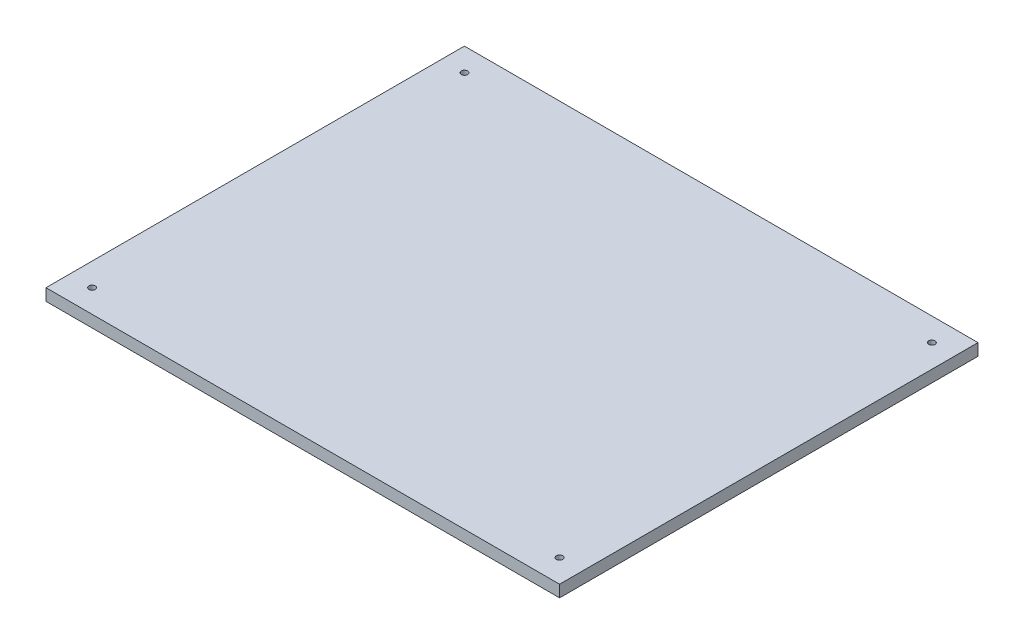
ISO-10303-21;
HEADER;
FILE_DESCRIPTION(('STEP AP214'),'2;1');
FILE_NAME('part.step','',(''),(''),'','','');
FILE_SCHEMA(('AUTOMOTIVE_DESIGN { 1 0 10303 214 1 1 1 1 }'));
ENDSEC;
DATA;
#1=APPLICATION_CONTEXT('core data for automotive mechanical design processes');
#2=APPLICATION_PROTOCOL_DEFINITION('international standard','automotive_design',2000,#1);
#3=PRODUCT_CONTEXT('',#1,'mechanical');
#4=PRODUCT('Part','Part','',(#3));
#5=PRODUCT_RELATED_PRODUCT_CATEGORY('part','',(#4));
#6=PRODUCT_DEFINITION_FORMATION('','',#4);
#7=PRODUCT_DEFINITION_CONTEXT('part definition',#1,'design');
#8=PRODUCT_DEFINITION('design','',#6,#7);
#9=PRODUCT_DEFINITION_SHAPE('','',#8);
#10=(LENGTH_UNIT() NAMED_UNIT(*) SI_UNIT(.MILLI.,.METRE.));
#11=(NAMED_UNIT(*) PLANE_ANGLE_UNIT() SI_UNIT($,.RADIAN.));
#12=(NAMED_UNIT(*) SI_UNIT($,.STERADIAN.) SOLID_ANGLE_UNIT());
#13=UNCERTAINTY_MEASURE_WITH_UNIT(LENGTH_MEASURE(1.E-05),#10,'distance_accuracy_value','');
#14=(GEOMETRIC_REPRESENTATION_CONTEXT(3) GLOBAL_UNCERTAINTY_ASSIGNED_CONTEXT((#13)) GLOBAL_UNIT_ASSIGNED_CONTEXT((#10,
#11,#12)) REPRESENTATION_CONTEXT('',''));
#15=CARTESIAN_POINT('',(0.,0.,0.));
#16=DIRECTION('',(0.,0.,1.));
#17=DIRECTION('',(1.,0.,0.));
#18=AXIS2_PLACEMENT_3D('',#15,#16,#17);
#19=CARTESIAN_POINT('',(137.3886,6.35,-111.9378));
#20=DIRECTION('',(-1.,0.,0.));
#21=DIRECTION('',(0.,0.,1.));
#22=AXIS2_PLACEMENT_3D('',#19,#20,#21);
#23=PLANE('',#22);
#24=DIRECTION('',(0.,0.,-1.));
#25=VECTOR('',#24,1.);
#26=CARTESIAN_POINT('',(137.3886,0.,-111.9378));
#27=LINE('',#26,#25);
#28=CARTESIAN_POINT('',(137.3886,0.,111.9378));
#29=VERTEX_POINT('',#28);
#30=CARTESIAN_POINT('',(137.3886,0.,-111.9378));
#31=VERTEX_POINT('',#30);
#32=EDGE_CURVE('E107',#29,#31,#27,.T.);
#33=ORIENTED_EDGE('',*,*,#32,.T.);
#34=DIRECTION('',(0.,-1.,0.));
#35=VECTOR('',#34,1.);
#36=CARTESIAN_POINT('',(137.3886,6.35,-111.9378));
#37=LINE('',#36,#35);
#38=CARTESIAN_POINT('',(137.3886,6.35,-111.9378));
#39=VERTEX_POINT('',#38);
#40=EDGE_CURVE('E11',#39,#31,#37,.T.);
#41=ORIENTED_EDGE('',*,*,#40,.F.);
#42=DIRECTION('',(0.,0.,-1.));
#43=VECTOR('',#42,1.);
#44=CARTESIAN_POINT('',(137.3886,6.35,-111.9378));
#45=LINE('',#44,#43);
#46=CARTESIAN_POINT('',(137.3886,6.35,111.9378));
#47=VERTEX_POINT('',#46);
#48=EDGE_CURVE('E91',#47,#39,#45,.T.);
#49=ORIENTED_EDGE('',*,*,#48,.F.);
#50=DIRECTION('',(0.,-1.,0.));
#51=VECTOR('',#50,1.);
#52=CARTESIAN_POINT('',(137.3886,6.35,111.9378));
#53=LINE('',#52,#51);
#54=EDGE_CURVE('E103',#47,#29,#53,.T.);
#55=ORIENTED_EDGE('',*,*,#54,.T.);
#56=EDGE_LOOP('',(#33,#41,#49,#55));
#57=FACE_BOUND('',#56,.T.);
#58=ADVANCED_FACE('F39',(#57),#23,.F.);
#59=CARTESIAN_POINT('',(-137.3886,6.35,-111.9378));
#60=DIRECTION('',(0.,0.,1.));
#61=DIRECTION('',(1.,0.,0.));
#62=AXIS2_PLACEMENT_3D('',#59,#60,#61);
#63=PLANE('',#62);
#64=DIRECTION('',(-1.,0.,0.));
#65=VECTOR('',#64,1.);
#66=CARTESIAN_POINT('',(-137.3886,0.,-111.9378));
#67=LINE('',#66,#65);
#68=CARTESIAN_POINT('',(-137.3886,0.,-111.9378));
#69=VERTEX_POINT('',#68);
#70=EDGE_CURVE('E96',#31,#69,#67,.T.);
#71=ORIENTED_EDGE('',*,*,#70,.T.);
#72=DIRECTION('',(0.,-1.,0.));
#73=VECTOR('',#72,1.);
#74=CARTESIAN_POINT('',(-137.3886,6.35,-111.9378));
#75=LINE('',#74,#73);
#76=CARTESIAN_POINT('',(-137.3886,6.35,-111.9378));
#77=VERTEX_POINT('',#76);
#78=EDGE_CURVE('E48',#77,#69,#75,.T.);
#79=ORIENTED_EDGE('',*,*,#78,.F.);
#80=DIRECTION('',(-1.,0.,0.));
#81=VECTOR('',#80,1.);
#82=CARTESIAN_POINT('',(-137.3886,6.35,-111.9378));
#83=LINE('',#82,#81);
#84=EDGE_CURVE('E86',#39,#77,#83,.T.);
#85=ORIENTED_EDGE('',*,*,#84,.F.);
#86=ORIENTED_EDGE('',*,*,#40,.T.);
#87=EDGE_LOOP('',(#71,#79,#85,#86));
#88=FACE_BOUND('',#87,.T.);
#89=ADVANCED_FACE('F95',(#88),#63,.F.);
#90=CARTESIAN_POINT('',(-137.3886,6.35,-111.9378));
#91=DIRECTION('',(1.,0.,0.));
#92=DIRECTION('',(0.,0.,-1.));
#93=AXIS2_PLACEMENT_3D('',#90,#91,#92);
#94=PLANE('',#93);
#95=DIRECTION('',(0.,0.,1.));
#96=VECTOR('',#95,1.);
#97=CARTESIAN_POINT('',(-137.3886,0.,-111.9378));
#98=LINE('',#97,#96);
#99=CARTESIAN_POINT('',(-137.3886,0.,111.9378));
#100=VERTEX_POINT('',#99);
#101=EDGE_CURVE('E73',#69,#100,#98,.T.);
#102=ORIENTED_EDGE('',*,*,#101,.T.);
#103=DIRECTION('',(0.,-1.,0.));
#104=VECTOR('',#103,1.);
#105=CARTESIAN_POINT('',(-137.3886,6.35,111.9378));
#106=LINE('',#105,#104);
#107=CARTESIAN_POINT('',(-137.3886,6.35,111.9378));
#108=VERTEX_POINT('',#107);
#109=EDGE_CURVE('E98',#108,#100,#106,.T.);
#110=ORIENTED_EDGE('',*,*,#109,.F.);
#111=DIRECTION('',(0.,0.,1.));
#112=VECTOR('',#111,1.);
#113=CARTESIAN_POINT('',(-137.3886,6.35,-111.9378));
#114=LINE('',#113,#112);
#115=EDGE_CURVE('E89',#77,#108,#114,.T.);
#116=ORIENTED_EDGE('',*,*,#115,.F.);
#117=ORIENTED_EDGE('',*,*,#78,.T.);
#118=EDGE_LOOP('',(#102,#110,#116,#117));
#119=FACE_BOUND('',#118,.T.);
#120=ADVANCED_FACE('F99',(#119),#94,.F.);
#121=CARTESIAN_POINT('',(-137.3886,6.35,111.9378));
#122=DIRECTION('',(0.,0.,-1.));
#123=DIRECTION('',(-1.,0.,0.));
#124=AXIS2_PLACEMENT_3D('',#121,#122,#123);
#125=PLANE('',#124);
#126=DIRECTION('',(1.,0.,0.));
#127=VECTOR('',#126,1.);
#128=CARTESIAN_POINT('',(-137.3886,0.,111.9378));
#129=LINE('',#128,#127);
#130=EDGE_CURVE('E79',#100,#29,#129,.T.);
#131=ORIENTED_EDGE('',*,*,#130,.T.);
#132=ORIENTED_EDGE('',*,*,#54,.F.);
#133=DIRECTION('',(1.,0.,0.));
#134=VECTOR('',#133,1.);
#135=CARTESIAN_POINT('',(-137.3886,6.35,111.9378));
#136=LINE('',#135,#134);
#137=EDGE_CURVE('E56',#108,#47,#136,.T.);
#138=ORIENTED_EDGE('',*,*,#137,.F.);
#139=ORIENTED_EDGE('',*,*,#109,.T.);
#140=EDGE_LOOP('',(#131,#132,#138,#139));
#141=FACE_BOUND('',#140,.T.);
#142=ADVANCED_FACE('F121',(#141),#125,.F.);
#143=CARTESIAN_POINT('',(0.,6.35,0.));
#144=DIRECTION('',(0.,1.,0.));
#145=DIRECTION('',(0.,0.,1.));
#146=AXIS2_PLACEMENT_3D('',#143,#144,#145);
#147=PLANE('',#146);
#148=CARTESIAN_POINT('',(125.0442,6.35,99.5934));
#149=DIRECTION('',(0.,1.,0.));
#150=DIRECTION('',(0.,0.,1.));
#151=AXIS2_PLACEMENT_3D('',#148,#149,#150);
#152=CIRCLE('',#151,1.69999999999998);
#153=CARTESIAN_POINT('',(125.0442,6.35,101.2934));
#154=VERTEX_POINT('',#153);
#155=EDGE_CURVE('E155',#154,#154,#152,.T.);
#156=ORIENTED_EDGE('',*,*,#155,.F.);
#157=EDGE_LOOP('',(#156));
#158=FACE_BOUND('',#157,.T.);
#159=CARTESIAN_POINT('',(-125.0442,6.35,99.5934));
#160=DIRECTION('',(0.,1.,0.));
#161=DIRECTION('',(0.,0.,1.));
#162=AXIS2_PLACEMENT_3D('',#159,#160,#161);
#163=CIRCLE('',#162,1.69999999999999);
#164=CARTESIAN_POINT('',(-125.0442,6.35,101.2934));
#165=VERTEX_POINT('',#164);
#166=EDGE_CURVE('E147',#165,#165,#163,.T.);
#167=ORIENTED_EDGE('',*,*,#166,.F.);
#168=EDGE_LOOP('',(#167));
#169=FACE_BOUND('',#168,.T.);
#170=CARTESIAN_POINT('',(-125.0442,6.35,-99.5934));
#171=DIRECTION('',(0.,1.,0.));
#172=DIRECTION('',(0.,0.,1.));
#173=AXIS2_PLACEMENT_3D('',#170,#171,#172);
#174=CIRCLE('',#173,1.69999999999999);
#175=CARTESIAN_POINT('',(-125.0442,6.35,-97.8934));
#176=VERTEX_POINT('',#175);
#177=EDGE_CURVE('E139',#176,#176,#174,.T.);
#178=ORIENTED_EDGE('',*,*,#177,.F.);
#179=EDGE_LOOP('',(#178));
#180=FACE_BOUND('',#179,.T.);
#181=CARTESIAN_POINT('',(125.0442,6.35,-99.5934));
#182=DIRECTION('',(0.,1.,0.));
#183=DIRECTION('',(0.,0.,1.));
#184=AXIS2_PLACEMENT_3D('',#181,#182,#183);
#185=CIRCLE('',#184,1.69999999999998);
#186=CARTESIAN_POINT('',(125.0442,6.35,-97.8934));
#187=VERTEX_POINT('',#186);
#188=EDGE_CURVE('E131',#187,#187,#185,.T.);
#189=ORIENTED_EDGE('',*,*,#188,.F.);
#190=EDGE_LOOP('',(#189));
#191=FACE_BOUND('',#190,.T.);
#192=ORIENTED_EDGE('',*,*,#48,.T.);
#193=ORIENTED_EDGE('',*,*,#84,.T.);
#194=ORIENTED_EDGE('',*,*,#115,.T.);
#195=ORIENTED_EDGE('',*,*,#137,.T.);
#196=EDGE_LOOP('',(#192,#193,#194,#195));
#197=FACE_BOUND('',#196,.T.);
#198=ADVANCED_FACE('F87',(#158,#169,#180,#191,#197),#147,.T.);
#199=CARTESIAN_POINT('',(0.,0.,0.));
#200=DIRECTION('',(0.,1.,0.));
#201=DIRECTION('',(0.,0.,1.));
#202=AXIS2_PLACEMENT_3D('',#199,#200,#201);
#203=PLANE('',#202);
#204=CARTESIAN_POINT('',(125.0442,0.,99.5934));
#205=DIRECTION('',(0.,1.,0.));
#206=DIRECTION('',(0.,0.,1.));
#207=AXIS2_PLACEMENT_3D('',#204,#205,#206);
#208=CIRCLE('',#207,1.70000000000001);
#209=CARTESIAN_POINT('',(125.0442,0.,101.2934));
#210=VERTEX_POINT('',#209);
#211=EDGE_CURVE('E151',#210,#210,#208,.T.);
#212=ORIENTED_EDGE('',*,*,#211,.T.);
#213=EDGE_LOOP('',(#212));
#214=FACE_BOUND('',#213,.T.);
#215=CARTESIAN_POINT('',(-125.0442,0.,99.5934));
#216=DIRECTION('',(0.,1.,0.));
#217=DIRECTION('',(0.,0.,1.));
#218=AXIS2_PLACEMENT_3D('',#215,#216,#217);
#219=CIRCLE('',#218,1.69999999999999);
#220=CARTESIAN_POINT('',(-125.0442,0.,101.2934));
#221=VERTEX_POINT('',#220);
#222=EDGE_CURVE('E143',#221,#221,#219,.T.);
#223=ORIENTED_EDGE('',*,*,#222,.T.);
#224=EDGE_LOOP('',(#223));
#225=FACE_BOUND('',#224,.T.);
#226=CARTESIAN_POINT('',(-125.0442,0.,-99.5934));
#227=DIRECTION('',(0.,1.,0.));
#228=DIRECTION('',(0.,0.,1.));
#229=AXIS2_PLACEMENT_3D('',#226,#227,#228);
#230=CIRCLE('',#229,1.69999999999999);
#231=CARTESIAN_POINT('',(-125.0442,0.,-97.8934));
#232=VERTEX_POINT('',#231);
#233=EDGE_CURVE('E135',#232,#232,#230,.T.);
#234=ORIENTED_EDGE('',*,*,#233,.T.);
#235=EDGE_LOOP('',(#234));
#236=FACE_BOUND('',#235,.T.);
#237=CARTESIAN_POINT('',(125.0442,0.,-99.5934));
#238=DIRECTION('',(0.,1.,0.));
#239=DIRECTION('',(0.,0.,1.));
#240=AXIS2_PLACEMENT_3D('',#237,#238,#239);
#241=CIRCLE('',#240,1.70000000000001);
#242=CARTESIAN_POINT('',(125.0442,0.,-97.8934));
#243=VERTEX_POINT('',#242);
#244=EDGE_CURVE('E111',#243,#243,#241,.T.);
#245=ORIENTED_EDGE('',*,*,#244,.T.);
#246=EDGE_LOOP('',(#245));
#247=FACE_BOUND('',#246,.T.);
#248=ORIENTED_EDGE('',*,*,#32,.F.);
#249=ORIENTED_EDGE('',*,*,#130,.F.);
#250=ORIENTED_EDGE('',*,*,#101,.F.);
#251=ORIENTED_EDGE('',*,*,#70,.F.);
#252=EDGE_LOOP('',(#248,#249,#250,#251));
#253=FACE_BOUND('',#252,.T.);
#254=ADVANCED_FACE('F124',(#214,#225,#236,#247,#253),#203,.F.);
#255=CARTESIAN_POINT('',(125.0442,6.35,-99.5934));
#256=DIRECTION('',(0.,1.,0.));
#257=DIRECTION('',(0.,0.,1.));
#258=AXIS2_PLACEMENT_3D('',#255,#256,#257);
#259=CYLINDRICAL_SURFACE('',#258,1.69999999999999);
#260=ORIENTED_EDGE('',*,*,#244,.F.);
#261=EDGE_LOOP('',(#260));
#262=FACE_BOUND('',#261,.T.);
#263=ORIENTED_EDGE('',*,*,#188,.T.);
#264=EDGE_LOOP('',(#263));
#265=FACE_BOUND('',#264,.T.);
#266=ADVANCED_FACE('F171',(#262,#265),#259,.F.);
#267=CARTESIAN_POINT('',(-125.0442,6.35,-99.5934));
#268=DIRECTION('',(0.,1.,0.));
#269=DIRECTION('',(0.,0.,1.));
#270=AXIS2_PLACEMENT_3D('',#267,#268,#269);
#271=CYLINDRICAL_SURFACE('',#270,1.69999999999999);
#272=ORIENTED_EDGE('',*,*,#233,.F.);
#273=EDGE_LOOP('',(#272));
#274=FACE_BOUND('',#273,.T.);
#275=ORIENTED_EDGE('',*,*,#177,.T.);
#276=EDGE_LOOP('',(#275));
#277=FACE_BOUND('',#276,.T.);
#278=ADVANCED_FACE('F173',(#274,#277),#271,.F.);
#279=CARTESIAN_POINT('',(-125.0442,6.35,99.5934));
#280=DIRECTION('',(0.,1.,0.));
#281=DIRECTION('',(0.,0.,1.));
#282=AXIS2_PLACEMENT_3D('',#279,#280,#281);
#283=CYLINDRICAL_SURFACE('',#282,1.69999999999999);
#284=ORIENTED_EDGE('',*,*,#222,.F.);
#285=EDGE_LOOP('',(#284));
#286=FACE_BOUND('',#285,.T.);
#287=ORIENTED_EDGE('',*,*,#166,.T.);
#288=EDGE_LOOP('',(#287));
#289=FACE_BOUND('',#288,.T.);
#290=ADVANCED_FACE('F180',(#286,#289),#283,.F.);
#291=CARTESIAN_POINT('',(125.0442,6.35,99.5934));
#292=DIRECTION('',(0.,1.,0.));
#293=DIRECTION('',(0.,0.,1.));
#294=AXIS2_PLACEMENT_3D('',#291,#292,#293);
#295=CYLINDRICAL_SURFACE('',#294,1.69999999999999);
#296=ORIENTED_EDGE('',*,*,#211,.F.);
#297=EDGE_LOOP('',(#296));
#298=FACE_BOUND('',#297,.T.);
#299=ORIENTED_EDGE('',*,*,#155,.T.);
#300=EDGE_LOOP('',(#299));
#301=FACE_BOUND('',#300,.T.);
#302=ADVANCED_FACE('F160',(#298,#301),#295,.F.);
#303=CLOSED_SHELL('',(#58,#89,#120,#142,#198,#254,#266,#278,#290,#302));
#304=MANIFOLD_SOLID_BREP('B2',#303);
#305=ADVANCED_BREP_SHAPE_REPRESENTATION('',(#18,#304),#14);
#306=SHAPE_DEFINITION_REPRESENTATION(#9,#305);
ENDSEC;
END-ISO-10303-21;
